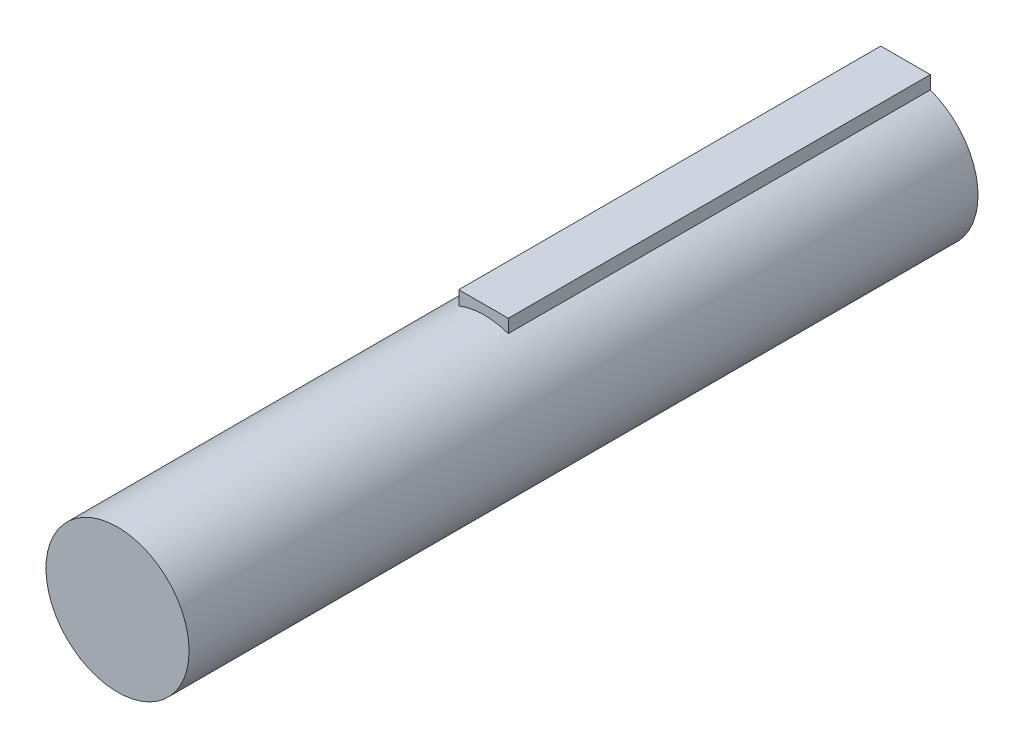
ISO-10303-21;
HEADER;
FILE_DESCRIPTION(('STEP AP214'),'2;1');
FILE_NAME('part.step','',(''),(''),'','','');
FILE_SCHEMA(('AUTOMOTIVE_DESIGN { 1 0 10303 214 1 1 1 1 }'));
ENDSEC;
DATA;
#1=APPLICATION_CONTEXT('core data for automotive mechanical design processes');
#2=APPLICATION_PROTOCOL_DEFINITION('international standard','automotive_design',2000,#1);
#3=PRODUCT_CONTEXT('',#1,'mechanical');
#4=PRODUCT('Part','Part','',(#3));
#5=PRODUCT_RELATED_PRODUCT_CATEGORY('part','',(#4));
#6=PRODUCT_DEFINITION_FORMATION('','',#4);
#7=PRODUCT_DEFINITION_CONTEXT('part definition',#1,'design');
#8=PRODUCT_DEFINITION('design','',#6,#7);
#9=PRODUCT_DEFINITION_SHAPE('','',#8);
#10=(LENGTH_UNIT() NAMED_UNIT(*) SI_UNIT(.MILLI.,.METRE.));
#11=(NAMED_UNIT(*) PLANE_ANGLE_UNIT() SI_UNIT($,.RADIAN.));
#12=(NAMED_UNIT(*) SI_UNIT($,.STERADIAN.) SOLID_ANGLE_UNIT());
#13=UNCERTAINTY_MEASURE_WITH_UNIT(LENGTH_MEASURE(1.E-05),#10,'distance_accuracy_value','');
#14=(GEOMETRIC_REPRESENTATION_CONTEXT(3) GLOBAL_UNCERTAINTY_ASSIGNED_CONTEXT((#13)) GLOBAL_UNIT_ASSIGNED_CONTEXT((#10,
#11,#12)) REPRESENTATION_CONTEXT('',''));
#15=CARTESIAN_POINT('',(0.,0.,0.));
#16=DIRECTION('',(0.,0.,1.));
#17=DIRECTION('',(1.,0.,0.));
#18=AXIS2_PLACEMENT_3D('',#15,#16,#17);
#19=CARTESIAN_POINT('',(1.3,3.67695526217005,23.));
#20=DIRECTION('',(-1.,0.,0.));
#21=DIRECTION('',(0.,0.,1.));
#22=AXIS2_PLACEMENT_3D('',#19,#20,#21);
#23=PLANE('',#22);
#24=DIRECTION('',(0.,1.,0.));
#25=VECTOR('',#24,1.);
#26=CARTESIAN_POINT('',(1.3,3.67695526217005,0.));
#27=LINE('',#26,#25);
#28=CARTESIAN_POINT('',(1.3,3.67695526217005,0.));
#29=VERTEX_POINT('',#28);
#30=CARTESIAN_POINT('',(1.3,4.4,0.));
#31=VERTEX_POINT('',#30);
#32=EDGE_CURVE('E98',#29,#31,#27,.T.);
#33=ORIENTED_EDGE('',*,*,#32,.T.);
#34=DIRECTION('',(0.,0.,-1.));
#35=VECTOR('',#34,1.);
#36=CARTESIAN_POINT('',(1.3,4.4,23.));
#37=LINE('',#36,#35);
#38=CARTESIAN_POINT('',(1.3,4.4,23.));
#39=VERTEX_POINT('',#38);
#40=EDGE_CURVE('E11',#39,#31,#37,.T.);
#41=ORIENTED_EDGE('',*,*,#40,.F.);
#42=DIRECTION('',(0.,1.,0.));
#43=VECTOR('',#42,1.);
#44=CARTESIAN_POINT('',(1.3,3.67695526217005,23.));
#45=LINE('',#44,#43);
#46=CARTESIAN_POINT('',(1.3,3.67695526217005,23.));
#47=VERTEX_POINT('',#46);
#48=EDGE_CURVE('E83',#47,#39,#45,.T.);
#49=ORIENTED_EDGE('',*,*,#48,.F.);
#50=DIRECTION('',(0.,0.,-1.));
#51=VECTOR('',#50,1.);
#52=CARTESIAN_POINT('',(1.3,3.67695526217005,23.));
#53=LINE('',#52,#51);
#54=EDGE_CURVE('E85',#47,#29,#53,.T.);
#55=ORIENTED_EDGE('',*,*,#54,.T.);
#56=EDGE_LOOP('',(#33,#41,#49,#55));
#57=FACE_BOUND('',#56,.T.);
#58=ADVANCED_FACE('F33',(#57),#23,.F.);
#59=CARTESIAN_POINT('',(-1.4,4.4,23.));
#60=DIRECTION('',(0.,-1.,0.));
#61=DIRECTION('',(0.,0.,-1.));
#62=AXIS2_PLACEMENT_3D('',#59,#60,#61);
#63=PLANE('',#62);
#64=DIRECTION('',(-1.,0.,0.));
#65=VECTOR('',#64,1.);
#66=CARTESIAN_POINT('',(-1.4,4.4,0.));
#67=LINE('',#66,#65);
#68=CARTESIAN_POINT('',(-1.4,4.4,0.));
#69=VERTEX_POINT('',#68);
#70=EDGE_CURVE('E104',#31,#69,#67,.T.);
#71=ORIENTED_EDGE('',*,*,#70,.T.);
#72=DIRECTION('',(0.,0.,-1.));
#73=VECTOR('',#72,1.);
#74=CARTESIAN_POINT('',(-1.4,4.4,23.));
#75=LINE('',#74,#73);
#76=CARTESIAN_POINT('',(-1.4,4.4,23.));
#77=VERTEX_POINT('',#76);
#78=EDGE_CURVE('E41',#77,#69,#75,.T.);
#79=ORIENTED_EDGE('',*,*,#78,.F.);
#80=DIRECTION('',(-1.,0.,0.));
#81=VECTOR('',#80,1.);
#82=CARTESIAN_POINT('',(-1.4,4.4,23.));
#83=LINE('',#82,#81);
#84=EDGE_CURVE('E77',#39,#77,#83,.T.);
#85=ORIENTED_EDGE('',*,*,#84,.F.);
#86=ORIENTED_EDGE('',*,*,#40,.T.);
#87=EDGE_LOOP('',(#71,#79,#85,#86));
#88=FACE_BOUND('',#87,.T.);
#89=ADVANCED_FACE('F111',(#88),#63,.F.);
#90=CARTESIAN_POINT('',(-1.4,3.64005494464026,23.));
#91=DIRECTION('',(1.,0.,0.));
#92=DIRECTION('',(0.,0.,-1.));
#93=AXIS2_PLACEMENT_3D('',#90,#91,#92);
#94=PLANE('',#93);
#95=DIRECTION('',(0.,-1.,0.));
#96=VECTOR('',#95,1.);
#97=CARTESIAN_POINT('',(-1.4,3.64005494464026,0.));
#98=LINE('',#97,#96);
#99=CARTESIAN_POINT('',(-1.4,3.64005494464026,0.));
#100=VERTEX_POINT('',#99);
#101=EDGE_CURVE('E66',#69,#100,#98,.T.);
#102=ORIENTED_EDGE('',*,*,#101,.T.);
#103=DIRECTION('',(0.,0.,-1.));
#104=VECTOR('',#103,1.);
#105=CARTESIAN_POINT('',(-1.4,3.64005494464026,23.));
#106=LINE('',#105,#104);
#107=CARTESIAN_POINT('',(-1.4,3.64005494464026,23.));
#108=VERTEX_POINT('',#107);
#109=EDGE_CURVE('E92',#108,#100,#106,.T.);
#110=ORIENTED_EDGE('',*,*,#109,.F.);
#111=DIRECTION('',(0.,-1.,0.));
#112=VECTOR('',#111,1.);
#113=CARTESIAN_POINT('',(-1.4,3.64005494464026,23.));
#114=LINE('',#113,#112);
#115=EDGE_CURVE('E49',#77,#108,#114,.T.);
#116=ORIENTED_EDGE('',*,*,#115,.F.);
#117=ORIENTED_EDGE('',*,*,#78,.T.);
#118=EDGE_LOOP('',(#102,#110,#116,#117));
#119=FACE_BOUND('',#118,.T.);
#120=ADVANCED_FACE('F108',(#119),#94,.F.);
#121=CARTESIAN_POINT('',(0.,0.,23.));
#122=DIRECTION('',(0.,0.,-1.));
#123=DIRECTION('',(-1.,0.,0.));
#124=AXIS2_PLACEMENT_3D('',#121,#122,#123);
#125=CYLINDRICAL_SURFACE('',#124,3.9);
#126=CARTESIAN_POINT('',(0.,0.,0.));
#127=DIRECTION('',(0.,0.,1.));
#128=DIRECTION('',(1.,0.,0.));
#129=AXIS2_PLACEMENT_3D('',#126,#127,#128);
#130=CIRCLE('',#129,3.9);
#131=EDGE_CURVE('E72',#100,#29,#130,.T.);
#132=ORIENTED_EDGE('',*,*,#131,.T.);
#133=ORIENTED_EDGE('',*,*,#54,.F.);
#134=CARTESIAN_POINT('',(0.,0.,23.));
#135=DIRECTION('',(0.,0.,1.));
#136=DIRECTION('',(1.,0.,0.));
#137=AXIS2_PLACEMENT_3D('',#134,#135,#136);
#138=CIRCLE('',#137,3.9);
#139=EDGE_CURVE('E91',#47,#108,#138,.T.);
#140=ORIENTED_EDGE('',*,*,#139,.T.);
#141=ORIENTED_EDGE('',*,*,#109,.T.);
#142=EDGE_LOOP('',(#132,#133,#140,#141));
#143=FACE_BOUND('',#142,.T.);
#144=CARTESIAN_POINT('',(0.,0.,43.));
#145=DIRECTION('',(0.,0.,1.));
#146=DIRECTION('',(1.,0.,0.));
#147=AXIS2_PLACEMENT_3D('',#144,#145,#146);
#148=CIRCLE('',#147,3.9);
#149=CARTESIAN_POINT('',(3.9,0.,43.));
#150=VERTEX_POINT('',#149);
#151=EDGE_CURVE('E95',#150,#150,#148,.T.);
#152=ORIENTED_EDGE('',*,*,#151,.F.);
#153=EDGE_LOOP('',(#152));
#154=FACE_BOUND('',#153,.T.);
#155=ADVANCED_FACE('F89',(#143,#154),#125,.T.);
#156=CARTESIAN_POINT('',(0.,0.,23.));
#157=DIRECTION('',(0.,0.,1.));
#158=DIRECTION('',(1.,0.,0.));
#159=AXIS2_PLACEMENT_3D('',#156,#157,#158);
#160=PLANE('',#159);
#161=ORIENTED_EDGE('',*,*,#139,.F.);
#162=ORIENTED_EDGE('',*,*,#48,.T.);
#163=ORIENTED_EDGE('',*,*,#84,.T.);
#164=ORIENTED_EDGE('',*,*,#115,.T.);
#165=EDGE_LOOP('',(#161,#162,#163,#164));
#166=FACE_BOUND('',#165,.T.);
#167=ADVANCED_FACE('F94',(#166),#160,.T.);
#168=CARTESIAN_POINT('',(0.,0.,0.));
#169=DIRECTION('',(0.,0.,1.));
#170=DIRECTION('',(1.,0.,0.));
#171=AXIS2_PLACEMENT_3D('',#168,#169,#170);
#172=PLANE('',#171);
#173=ORIENTED_EDGE('',*,*,#32,.F.);
#174=ORIENTED_EDGE('',*,*,#131,.F.);
#175=ORIENTED_EDGE('',*,*,#101,.F.);
#176=ORIENTED_EDGE('',*,*,#70,.F.);
#177=EDGE_LOOP('',(#173,#174,#175,#176));
#178=FACE_BOUND('',#177,.T.);
#179=ADVANCED_FACE('F110',(#178),#172,.F.);
#180=CARTESIAN_POINT('',(0.,0.,43.));
#181=DIRECTION('',(0.,0.,1.));
#182=DIRECTION('',(1.,0.,0.));
#183=AXIS2_PLACEMENT_3D('',#180,#181,#182);
#184=PLANE('',#183);
#185=ORIENTED_EDGE('',*,*,#151,.T.);
#186=EDGE_LOOP('',(#185));
#187=FACE_BOUND('',#186,.T.);
#188=ADVANCED_FACE('F123',(#187),#184,.T.);
#189=CLOSED_SHELL('',(#58,#89,#120,#155,#167,#179,#188));
#190=MANIFOLD_SOLID_BREP('B2',#189);
#191=ADVANCED_BREP_SHAPE_REPRESENTATION('',(#18,#190),#14);
#192=SHAPE_DEFINITION_REPRESENTATION(#9,#191);
ENDSEC;
END-ISO-10303-21;
